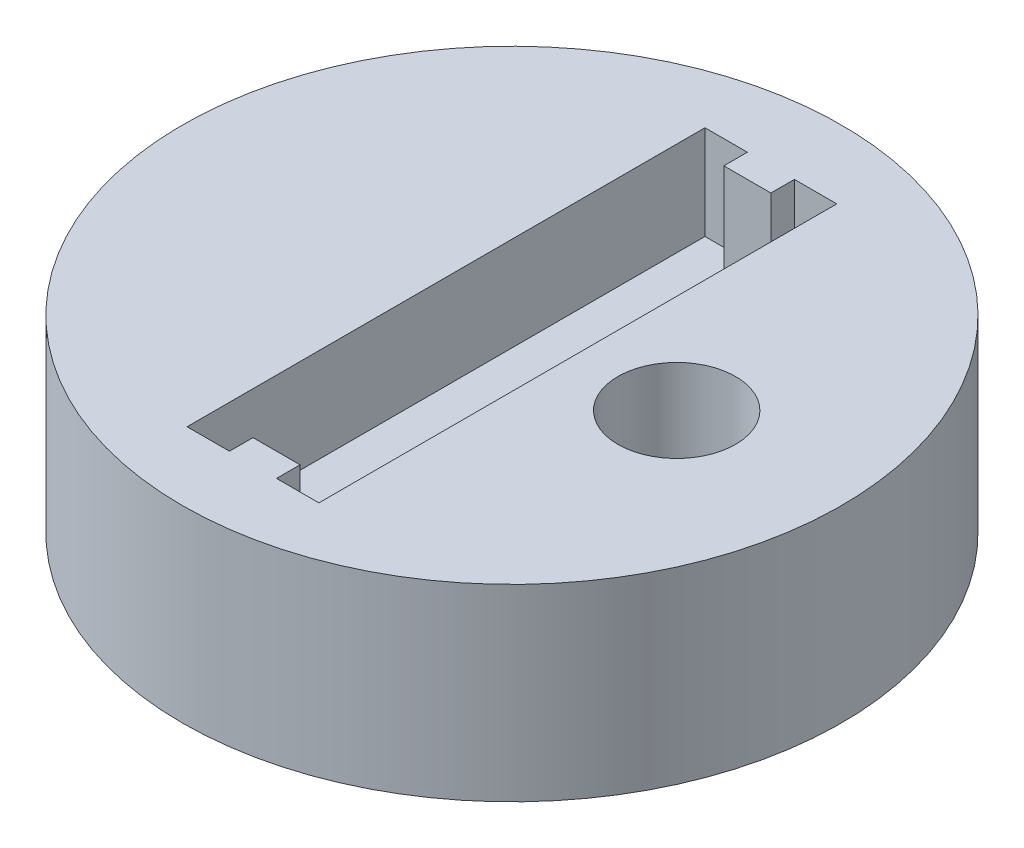
ISO-10303-21;
HEADER;
FILE_DESCRIPTION(('STEP AP214'),'2;1');
FILE_NAME('part.step','',(''),(''),'','','');
FILE_SCHEMA(('AUTOMOTIVE_DESIGN { 1 0 10303 214 1 1 1 1 }'));
ENDSEC;
DATA;
#1=APPLICATION_CONTEXT('core data for automotive mechanical design processes');
#2=APPLICATION_PROTOCOL_DEFINITION('international standard','automotive_design',2000,#1);
#3=PRODUCT_CONTEXT('',#1,'mechanical');
#4=PRODUCT('Part','Part','',(#3));
#5=PRODUCT_RELATED_PRODUCT_CATEGORY('part','',(#4));
#6=PRODUCT_DEFINITION_FORMATION('','',#4);
#7=PRODUCT_DEFINITION_CONTEXT('part definition',#1,'design');
#8=PRODUCT_DEFINITION('design','',#6,#7);
#9=PRODUCT_DEFINITION_SHAPE('','',#8);
#10=(LENGTH_UNIT() NAMED_UNIT(*) SI_UNIT(.MILLI.,.METRE.));
#11=(NAMED_UNIT(*) PLANE_ANGLE_UNIT() SI_UNIT($,.RADIAN.));
#12=(NAMED_UNIT(*) SI_UNIT($,.STERADIAN.) SOLID_ANGLE_UNIT());
#13=UNCERTAINTY_MEASURE_WITH_UNIT(LENGTH_MEASURE(1.E-05),#10,'distance_accuracy_value','');
#14=(GEOMETRIC_REPRESENTATION_CONTEXT(3) GLOBAL_UNCERTAINTY_ASSIGNED_CONTEXT((#13)) GLOBAL_UNIT_ASSIGNED_CONTEXT((#10,
#11,#12)) REPRESENTATION_CONTEXT('',''));
#15=CARTESIAN_POINT('',(0.,0.,0.));
#16=DIRECTION('',(0.,0.,1.));
#17=DIRECTION('',(1.,0.,0.));
#18=AXIS2_PLACEMENT_3D('',#15,#16,#17);
#19=CARTESIAN_POINT('',(0.5,2.,0.));
#20=DIRECTION('',(1.,0.,0.));
#21=DIRECTION('',(0.,0.,-1.));
#22=AXIS2_PLACEMENT_3D('',#19,#20,#21);
#23=PLANE('',#22);
#24=DIRECTION('',(0.,1.,0.));
#25=VECTOR('',#24,1.);
#26=CARTESIAN_POINT('',(0.5,2.,5.));
#27=LINE('',#26,#25);
#28=CARTESIAN_POINT('',(0.5,2.,5.));
#29=VERTEX_POINT('',#28);
#30=CARTESIAN_POINT('',(0.5,4.,5.));
#31=VERTEX_POINT('',#30);
#32=EDGE_CURVE('E180',#29,#31,#27,.T.);
#33=ORIENTED_EDGE('',*,*,#32,.T.);
#34=DIRECTION('',(0.,0.,-1.));
#35=VECTOR('',#34,1.);
#36=CARTESIAN_POINT('',(0.5,4.,0.));
#37=LINE('',#36,#35);
#38=CARTESIAN_POINT('',(0.5,4.,5.5));
#39=VERTEX_POINT('',#38);
#40=EDGE_CURVE('E58',#39,#31,#37,.T.);
#41=ORIENTED_EDGE('',*,*,#40,.F.);
#42=DIRECTION('',(0.,1.,0.));
#43=VECTOR('',#42,1.);
#44=CARTESIAN_POINT('',(0.5,2.,5.5));
#45=LINE('',#44,#43);
#46=CARTESIAN_POINT('',(0.5,2.,5.5));
#47=VERTEX_POINT('',#46);
#48=EDGE_CURVE('E201',#47,#39,#45,.T.);
#49=ORIENTED_EDGE('',*,*,#48,.F.);
#50=DIRECTION('',(0.,0.,-1.));
#51=VECTOR('',#50,1.);
#52=CARTESIAN_POINT('',(0.5,2.,0.));
#53=LINE('',#52,#51);
#54=EDGE_CURVE('E189',#47,#29,#53,.T.);
#55=ORIENTED_EDGE('',*,*,#54,.T.);
#56=EDGE_LOOP('',(#33,#41,#49,#55));
#57=FACE_BOUND('',#56,.T.);
#58=ADVANCED_FACE('F35',(#57),#23,.T.);
#59=CARTESIAN_POINT('',(0.,4.,0.));
#60=DIRECTION('',(0.,1.,0.));
#61=DIRECTION('',(0.,0.,1.));
#62=AXIS2_PLACEMENT_3D('',#59,#60,#61);
#63=PLANE('',#62);
#64=CARTESIAN_POINT('',(3.5,4.,0.));
#65=DIRECTION('',(0.,1.,0.));
#66=DIRECTION('',(0.,0.,1.));
#67=AXIS2_PLACEMENT_3D('',#64,#65,#66);
#68=CIRCLE('',#67,1.25);
#69=CARTESIAN_POINT('',(3.5,4.,1.25));
#70=VERTEX_POINT('',#69);
#71=EDGE_CURVE('E443',#70,#70,#68,.T.);
#72=ORIENTED_EDGE('',*,*,#71,.F.);
#73=EDGE_LOOP('',(#72));
#74=FACE_BOUND('',#73,.T.);
#75=DIRECTION('',(0.,0.,-1.));
#76=VECTOR('',#75,1.);
#77=CARTESIAN_POINT('',(-0.5,4.,0.));
#78=LINE('',#77,#76);
#79=CARTESIAN_POINT('',(-0.5,4.,5.5));
#80=VERTEX_POINT('',#79);
#81=CARTESIAN_POINT('',(-0.5,4.,5.));
#82=VERTEX_POINT('',#81);
#83=EDGE_CURVE('E158',#80,#82,#78,.T.);
#84=ORIENTED_EDGE('',*,*,#83,.F.);
#85=DIRECTION('',(-1.,0.,0.));
#86=VECTOR('',#85,1.);
#87=CARTESIAN_POINT('',(0.,4.,5.5));
#88=LINE('',#87,#86);
#89=CARTESIAN_POINT('',(-1.4,4.,5.5));
#90=VERTEX_POINT('',#89);
#91=EDGE_CURVE('E137',#80,#90,#88,.T.);
#92=ORIENTED_EDGE('',*,*,#91,.T.);
#93=DIRECTION('',(0.,0.,-1.));
#94=VECTOR('',#93,1.);
#95=CARTESIAN_POINT('',(-1.4,4.,0.));
#96=LINE('',#95,#94);
#97=CARTESIAN_POINT('',(-1.4,4.,-5.5));
#98=VERTEX_POINT('',#97);
#99=EDGE_CURVE('E162',#90,#98,#96,.T.);
#100=ORIENTED_EDGE('',*,*,#99,.T.);
#101=DIRECTION('',(-1.,0.,0.));
#102=VECTOR('',#101,1.);
#103=CARTESIAN_POINT('',(0.,4.,-5.5));
#104=LINE('',#103,#102);
#105=CARTESIAN_POINT('',(-0.5,4.,-5.5));
#106=VERTEX_POINT('',#105);
#107=EDGE_CURVE('E160',#106,#98,#104,.T.);
#108=ORIENTED_EDGE('',*,*,#107,.F.);
#109=CARTESIAN_POINT('',(-0.5,4.,-5.));
#110=VERTEX_POINT('',#109);
#111=EDGE_CURVE('E143',#110,#106,#78,.T.);
#112=ORIENTED_EDGE('',*,*,#111,.F.);
#113=DIRECTION('',(-1.,0.,0.));
#114=VECTOR('',#113,1.);
#115=CARTESIAN_POINT('',(-0.5,4.,-5.));
#116=LINE('',#115,#114);
#117=CARTESIAN_POINT('',(0.5,4.,-5.));
#118=VERTEX_POINT('',#117);
#119=EDGE_CURVE('E169',#118,#110,#116,.T.);
#120=ORIENTED_EDGE('',*,*,#119,.F.);
#121=CARTESIAN_POINT('',(0.5,4.,-5.5));
#122=VERTEX_POINT('',#121);
#123=EDGE_CURVE('E182',#118,#122,#37,.T.);
#124=ORIENTED_EDGE('',*,*,#123,.T.);
#125=DIRECTION('',(1.,0.,0.));
#126=VECTOR('',#125,1.);
#127=CARTESIAN_POINT('',(0.,4.,-5.5));
#128=LINE('',#127,#126);
#129=CARTESIAN_POINT('',(1.4,4.,-5.5));
#130=VERTEX_POINT('',#129);
#131=EDGE_CURVE('E209',#122,#130,#128,.T.);
#132=ORIENTED_EDGE('',*,*,#131,.T.);
#133=DIRECTION('',(0.,0.,-1.));
#134=VECTOR('',#133,1.);
#135=CARTESIAN_POINT('',(1.4,4.,0.));
#136=LINE('',#135,#134);
#137=CARTESIAN_POINT('',(1.4,4.,5.5));
#138=VERTEX_POINT('',#137);
#139=EDGE_CURVE('E206',#138,#130,#136,.T.);
#140=ORIENTED_EDGE('',*,*,#139,.F.);
#141=DIRECTION('',(1.,0.,0.));
#142=VECTOR('',#141,1.);
#143=CARTESIAN_POINT('',(0.,4.,5.5));
#144=LINE('',#143,#142);
#145=EDGE_CURVE('E203',#39,#138,#144,.T.);
#146=ORIENTED_EDGE('',*,*,#145,.F.);
#147=ORIENTED_EDGE('',*,*,#40,.T.);
#148=DIRECTION('',(1.,0.,0.));
#149=VECTOR('',#148,1.);
#150=CARTESIAN_POINT('',(-0.5,4.,5.));
#151=LINE('',#150,#149);
#152=EDGE_CURVE('E174',#82,#31,#151,.T.);
#153=ORIENTED_EDGE('',*,*,#152,.F.);
#154=EDGE_LOOP('',(#84,#92,#100,#108,#112,#120,#124,#132,#140,#146,#147,#153));
#155=FACE_BOUND('',#154,.T.);
#156=CARTESIAN_POINT('',(0.,4.,0.));
#157=DIRECTION('',(0.,1.,0.));
#158=DIRECTION('',(0.,0.,1.));
#159=AXIS2_PLACEMENT_3D('',#156,#157,#158);
#160=CIRCLE('',#159,7.);
#161=CARTESIAN_POINT('',(0.,4.,7.));
#162=VERTEX_POINT('',#161);
#163=EDGE_CURVE('E11',#162,#162,#160,.T.);
#164=ORIENTED_EDGE('',*,*,#163,.T.);
#165=EDGE_LOOP('',(#164));
#166=FACE_BOUND('',#165,.T.);
#167=ADVANCED_FACE('F226',(#74,#155,#166),#63,.T.);
#168=CARTESIAN_POINT('',(0.,4.,0.));
#169=DIRECTION('',(0.,-1.,0.));
#170=DIRECTION('',(0.,0.,-1.));
#171=AXIS2_PLACEMENT_3D('',#168,#169,#170);
#172=CYLINDRICAL_SURFACE('',#171,7.);
#173=ORIENTED_EDGE('',*,*,#163,.F.);
#174=EDGE_LOOP('',(#173));
#175=FACE_BOUND('',#174,.T.);
#176=CARTESIAN_POINT('',(0.,0.,0.));
#177=DIRECTION('',(0.,1.,0.));
#178=DIRECTION('',(0.,0.,1.));
#179=AXIS2_PLACEMENT_3D('',#176,#177,#178);
#180=CIRCLE('',#179,7.);
#181=CARTESIAN_POINT('',(0.,0.,7.));
#182=VERTEX_POINT('',#181);
#183=EDGE_CURVE('E39',#182,#182,#180,.T.);
#184=ORIENTED_EDGE('',*,*,#183,.T.);
#185=EDGE_LOOP('',(#184));
#186=FACE_BOUND('',#185,.T.);
#187=ADVANCED_FACE('F37',(#175,#186),#172,.T.);
#188=CARTESIAN_POINT('',(0.,0.,0.));
#189=DIRECTION('',(0.,1.,0.));
#190=DIRECTION('',(0.,0.,1.));
#191=AXIS2_PLACEMENT_3D('',#188,#189,#190);
#192=PLANE('',#191);
#193=ORIENTED_EDGE('',*,*,#183,.F.);
#194=EDGE_LOOP('',(#193));
#195=FACE_BOUND('',#194,.T.);
#196=ADVANCED_FACE('F266',(#195),#192,.F.);
#197=DIRECTION('',(0.,1.,0.));
#198=VECTOR('',#197,1.);
#199=CARTESIAN_POINT('',(0.5,2.,-5.));
#200=LINE('',#199,#198);
#201=CARTESIAN_POINT('',(0.5,2.,-5.));
#202=VERTEX_POINT('',#201);
#203=EDGE_CURVE('E176',#202,#118,#200,.T.);
#204=ORIENTED_EDGE('',*,*,#203,.F.);
#205=CARTESIAN_POINT('',(0.5,2.,-5.5));
#206=VERTEX_POINT('',#205);
#207=EDGE_CURVE('E193',#202,#206,#53,.T.);
#208=ORIENTED_EDGE('',*,*,#207,.T.);
#209=DIRECTION('',(0.,1.,0.));
#210=VECTOR('',#209,1.);
#211=CARTESIAN_POINT('',(0.5,2.,-5.5));
#212=LINE('',#211,#210);
#213=EDGE_CURVE('E212',#206,#122,#212,.T.);
#214=ORIENTED_EDGE('',*,*,#213,.T.);
#215=ORIENTED_EDGE('',*,*,#123,.F.);
#216=EDGE_LOOP('',(#204,#208,#214,#215));
#217=FACE_BOUND('',#216,.T.);
#218=ADVANCED_FACE('F255',(#217),#23,.T.);
#219=CARTESIAN_POINT('',(0.,2.,-5.5));
#220=DIRECTION('',(0.,0.,1.));
#221=DIRECTION('',(1.,0.,0.));
#222=AXIS2_PLACEMENT_3D('',#219,#220,#221);
#223=PLANE('',#222);
#224=ORIENTED_EDGE('',*,*,#131,.F.);
#225=ORIENTED_EDGE('',*,*,#213,.F.);
#226=DIRECTION('',(1.,0.,0.));
#227=VECTOR('',#226,1.);
#228=CARTESIAN_POINT('',(0.,2.,-5.5));
#229=LINE('',#228,#227);
#230=CARTESIAN_POINT('',(1.4,2.,-5.5));
#231=VERTEX_POINT('',#230);
#232=EDGE_CURVE('E199',#206,#231,#229,.T.);
#233=ORIENTED_EDGE('',*,*,#232,.T.);
#234=DIRECTION('',(0.,1.,0.));
#235=VECTOR('',#234,1.);
#236=CARTESIAN_POINT('',(1.4,2.,-5.5));
#237=LINE('',#236,#235);
#238=EDGE_CURVE('E215',#231,#130,#237,.T.);
#239=ORIENTED_EDGE('',*,*,#238,.T.);
#240=EDGE_LOOP('',(#224,#225,#233,#239));
#241=FACE_BOUND('',#240,.T.);
#242=ADVANCED_FACE('F258',(#241),#223,.T.);
#243=CARTESIAN_POINT('',(1.4,2.,0.));
#244=DIRECTION('',(1.,0.,0.));
#245=DIRECTION('',(0.,0.,-1.));
#246=AXIS2_PLACEMENT_3D('',#243,#244,#245);
#247=PLANE('',#246);
#248=ORIENTED_EDGE('',*,*,#139,.T.);
#249=ORIENTED_EDGE('',*,*,#238,.F.);
#250=DIRECTION('',(0.,0.,-1.));
#251=VECTOR('',#250,1.);
#252=CARTESIAN_POINT('',(1.4,2.,0.));
#253=LINE('',#252,#251);
#254=CARTESIAN_POINT('',(1.4,2.,5.5));
#255=VERTEX_POINT('',#254);
#256=EDGE_CURVE('E196',#255,#231,#253,.T.);
#257=ORIENTED_EDGE('',*,*,#256,.F.);
#258=DIRECTION('',(0.,1.,0.));
#259=VECTOR('',#258,1.);
#260=CARTESIAN_POINT('',(1.4,2.,5.5));
#261=LINE('',#260,#259);
#262=EDGE_CURVE('E217',#255,#138,#261,.T.);
#263=ORIENTED_EDGE('',*,*,#262,.T.);
#264=EDGE_LOOP('',(#248,#249,#257,#263));
#265=FACE_BOUND('',#264,.T.);
#266=ADVANCED_FACE('F232',(#265),#247,.F.);
#267=CARTESIAN_POINT('',(0.,2.,5.5));
#268=DIRECTION('',(0.,0.,1.));
#269=DIRECTION('',(1.,0.,0.));
#270=AXIS2_PLACEMENT_3D('',#267,#268,#269);
#271=PLANE('',#270);
#272=ORIENTED_EDGE('',*,*,#145,.T.);
#273=ORIENTED_EDGE('',*,*,#262,.F.);
#274=DIRECTION('',(1.,0.,0.));
#275=VECTOR('',#274,1.);
#276=CARTESIAN_POINT('',(0.,2.,5.5));
#277=LINE('',#276,#275);
#278=EDGE_CURVE('E192',#47,#255,#277,.T.);
#279=ORIENTED_EDGE('',*,*,#278,.F.);
#280=ORIENTED_EDGE('',*,*,#48,.T.);
#281=EDGE_LOOP('',(#272,#273,#279,#280));
#282=FACE_BOUND('',#281,.T.);
#283=ADVANCED_FACE('F222',(#282),#271,.F.);
#284=CARTESIAN_POINT('',(0.,2.,0.));
#285=DIRECTION('',(0.,1.,0.));
#286=DIRECTION('',(0.,0.,1.));
#287=AXIS2_PLACEMENT_3D('',#284,#285,#286);
#288=PLANE('',#287);
#289=ORIENTED_EDGE('',*,*,#54,.F.);
#290=ORIENTED_EDGE('',*,*,#278,.T.);
#291=ORIENTED_EDGE('',*,*,#256,.T.);
#292=ORIENTED_EDGE('',*,*,#232,.F.);
#293=ORIENTED_EDGE('',*,*,#207,.F.);
#294=DIRECTION('',(-1.,0.,0.));
#295=VECTOR('',#294,1.);
#296=CARTESIAN_POINT('',(-0.5,2.,-5.));
#297=LINE('',#296,#295);
#298=CARTESIAN_POINT('',(-0.5,2.,-5.));
#299=VERTEX_POINT('',#298);
#300=EDGE_CURVE('E133',#202,#299,#297,.T.);
#301=ORIENTED_EDGE('',*,*,#300,.T.);
#302=DIRECTION('',(0.,0.,-1.));
#303=VECTOR('',#302,1.);
#304=CARTESIAN_POINT('',(-0.5,2.,0.));
#305=LINE('',#304,#303);
#306=CARTESIAN_POINT('',(-0.5,2.,-5.5));
#307=VERTEX_POINT('',#306);
#308=EDGE_CURVE('E126',#299,#307,#305,.T.);
#309=ORIENTED_EDGE('',*,*,#308,.T.);
#310=DIRECTION('',(-1.,0.,0.));
#311=VECTOR('',#310,1.);
#312=CARTESIAN_POINT('',(0.,2.,-5.5));
#313=LINE('',#312,#311);
#314=CARTESIAN_POINT('',(-1.4,2.,-5.5));
#315=VERTEX_POINT('',#314);
#316=EDGE_CURVE('E131',#307,#315,#313,.T.);
#317=ORIENTED_EDGE('',*,*,#316,.T.);
#318=DIRECTION('',(0.,0.,-1.));
#319=VECTOR('',#318,1.);
#320=CARTESIAN_POINT('',(-1.4,2.,0.));
#321=LINE('',#320,#319);
#322=CARTESIAN_POINT('',(-1.4,2.,5.5));
#323=VERTEX_POINT('',#322);
#324=EDGE_CURVE('E152',#323,#315,#321,.T.);
#325=ORIENTED_EDGE('',*,*,#324,.F.);
#326=DIRECTION('',(-1.,0.,0.));
#327=VECTOR('',#326,1.);
#328=CARTESIAN_POINT('',(0.,2.,5.5));
#329=LINE('',#328,#327);
#330=CARTESIAN_POINT('',(-0.5,2.,5.5));
#331=VERTEX_POINT('',#330);
#332=EDGE_CURVE('E148',#331,#323,#329,.T.);
#333=ORIENTED_EDGE('',*,*,#332,.F.);
#334=CARTESIAN_POINT('',(-0.5,2.,5.));
#335=VERTEX_POINT('',#334);
#336=EDGE_CURVE('E136',#331,#335,#305,.T.);
#337=ORIENTED_EDGE('',*,*,#336,.T.);
#338=DIRECTION('',(1.,0.,0.));
#339=VECTOR('',#338,1.);
#340=CARTESIAN_POINT('',(-0.5,2.,5.));
#341=LINE('',#340,#339);
#342=EDGE_CURVE('E50',#335,#29,#341,.T.);
#343=ORIENTED_EDGE('',*,*,#342,.T.);
#344=EDGE_LOOP('',(#289,#290,#291,#292,#293,#301,#309,#317,#325,#333,#337,#343));
#345=FACE_BOUND('',#344,.T.);
#346=ADVANCED_FACE('F128',(#345),#288,.T.);
#347=CARTESIAN_POINT('',(-0.5,2.,5.));
#348=DIRECTION('',(0.,0.,1.));
#349=DIRECTION('',(1.,0.,0.));
#350=AXIS2_PLACEMENT_3D('',#347,#348,#349);
#351=PLANE('',#350);
#352=ORIENTED_EDGE('',*,*,#152,.T.);
#353=ORIENTED_EDGE('',*,*,#32,.F.);
#354=ORIENTED_EDGE('',*,*,#342,.F.);
#355=DIRECTION('',(0.,1.,0.));
#356=VECTOR('',#355,1.);
#357=CARTESIAN_POINT('',(-0.5,2.,5.));
#358=LINE('',#357,#356);
#359=EDGE_CURVE('E183',#335,#82,#358,.T.);
#360=ORIENTED_EDGE('',*,*,#359,.T.);
#361=EDGE_LOOP('',(#352,#353,#354,#360));
#362=FACE_BOUND('',#361,.T.);
#363=ADVANCED_FACE('F236',(#362),#351,.F.);
#364=CARTESIAN_POINT('',(-0.5,2.,-5.));
#365=DIRECTION('',(0.,0.,-1.));
#366=DIRECTION('',(-1.,0.,0.));
#367=AXIS2_PLACEMENT_3D('',#364,#365,#366);
#368=PLANE('',#367);
#369=ORIENTED_EDGE('',*,*,#119,.T.);
#370=DIRECTION('',(0.,1.,0.));
#371=VECTOR('',#370,1.);
#372=CARTESIAN_POINT('',(-0.5,2.,-5.));
#373=LINE('',#372,#371);
#374=EDGE_CURVE('E186',#299,#110,#373,.T.);
#375=ORIENTED_EDGE('',*,*,#374,.F.);
#376=ORIENTED_EDGE('',*,*,#300,.F.);
#377=ORIENTED_EDGE('',*,*,#203,.T.);
#378=EDGE_LOOP('',(#369,#375,#376,#377));
#379=FACE_BOUND('',#378,.T.);
#380=ADVANCED_FACE('F252',(#379),#368,.F.);
#381=CARTESIAN_POINT('',(-0.5,2.,0.));
#382=DIRECTION('',(1.,0.,0.));
#383=DIRECTION('',(0.,0.,-1.));
#384=AXIS2_PLACEMENT_3D('',#381,#382,#383);
#385=PLANE('',#384);
#386=ORIENTED_EDGE('',*,*,#336,.F.);
#387=DIRECTION('',(0.,1.,0.));
#388=VECTOR('',#387,1.);
#389=CARTESIAN_POINT('',(-0.5,2.,5.5));
#390=LINE('',#389,#388);
#391=EDGE_CURVE('E167',#331,#80,#390,.T.);
#392=ORIENTED_EDGE('',*,*,#391,.T.);
#393=ORIENTED_EDGE('',*,*,#83,.T.);
#394=ORIENTED_EDGE('',*,*,#359,.F.);
#395=EDGE_LOOP('',(#386,#392,#393,#394));
#396=FACE_BOUND('',#395,.T.);
#397=ADVANCED_FACE('F240',(#396),#385,.F.);
#398=ORIENTED_EDGE('',*,*,#111,.T.);
#399=DIRECTION('',(0.,1.,0.));
#400=VECTOR('',#399,1.);
#401=CARTESIAN_POINT('',(-0.5,2.,-5.5));
#402=LINE('',#401,#400);
#403=EDGE_CURVE('E140',#307,#106,#402,.T.);
#404=ORIENTED_EDGE('',*,*,#403,.F.);
#405=ORIENTED_EDGE('',*,*,#308,.F.);
#406=ORIENTED_EDGE('',*,*,#374,.T.);
#407=EDGE_LOOP('',(#398,#404,#405,#406));
#408=FACE_BOUND('',#407,.T.);
#409=ADVANCED_FACE('F141',(#408),#385,.F.);
#410=CARTESIAN_POINT('',(0.,2.,5.5));
#411=DIRECTION('',(0.,0.,-1.));
#412=DIRECTION('',(-1.,0.,0.));
#413=AXIS2_PLACEMENT_3D('',#410,#411,#412);
#414=PLANE('',#413);
#415=ORIENTED_EDGE('',*,*,#91,.F.);
#416=ORIENTED_EDGE('',*,*,#391,.F.);
#417=ORIENTED_EDGE('',*,*,#332,.T.);
#418=DIRECTION('',(0.,1.,0.));
#419=VECTOR('',#418,1.);
#420=CARTESIAN_POINT('',(-1.4,2.,5.5));
#421=LINE('',#420,#419);
#422=EDGE_CURVE('E170',#323,#90,#421,.T.);
#423=ORIENTED_EDGE('',*,*,#422,.T.);
#424=EDGE_LOOP('',(#415,#416,#417,#423));
#425=FACE_BOUND('',#424,.T.);
#426=ADVANCED_FACE('F243',(#425),#414,.T.);
#427=CARTESIAN_POINT('',(-1.4,2.,0.));
#428=DIRECTION('',(1.,0.,0.));
#429=DIRECTION('',(0.,0.,-1.));
#430=AXIS2_PLACEMENT_3D('',#427,#428,#429);
#431=PLANE('',#430);
#432=ORIENTED_EDGE('',*,*,#99,.F.);
#433=ORIENTED_EDGE('',*,*,#422,.F.);
#434=ORIENTED_EDGE('',*,*,#324,.T.);
#435=DIRECTION('',(0.,1.,0.));
#436=VECTOR('',#435,1.);
#437=CARTESIAN_POINT('',(-1.4,2.,-5.5));
#438=LINE('',#437,#436);
#439=EDGE_CURVE('E147',#315,#98,#438,.T.);
#440=ORIENTED_EDGE('',*,*,#439,.T.);
#441=EDGE_LOOP('',(#432,#433,#434,#440));
#442=FACE_BOUND('',#441,.T.);
#443=ADVANCED_FACE('F247',(#442),#431,.T.);
#444=CARTESIAN_POINT('',(0.,2.,-5.5));
#445=DIRECTION('',(0.,0.,-1.));
#446=DIRECTION('',(-1.,0.,0.));
#447=AXIS2_PLACEMENT_3D('',#444,#445,#446);
#448=PLANE('',#447);
#449=ORIENTED_EDGE('',*,*,#107,.T.);
#450=ORIENTED_EDGE('',*,*,#439,.F.);
#451=ORIENTED_EDGE('',*,*,#316,.F.);
#452=ORIENTED_EDGE('',*,*,#403,.T.);
#453=EDGE_LOOP('',(#449,#450,#451,#452));
#454=FACE_BOUND('',#453,.T.);
#455=ADVANCED_FACE('F151',(#454),#448,.F.);
#456=CARTESIAN_POINT('',(3.5,2.,0.));
#457=DIRECTION('',(0.,1.,0.));
#458=DIRECTION('',(0.,0.,1.));
#459=AXIS2_PLACEMENT_3D('',#456,#457,#458);
#460=CYLINDRICAL_SURFACE('',#459,1.25);
#461=CARTESIAN_POINT('',(3.5,2.,0.));
#462=DIRECTION('',(0.,1.,0.));
#463=DIRECTION('',(0.,0.,1.));
#464=AXIS2_PLACEMENT_3D('',#461,#462,#463);
#465=CIRCLE('',#464,1.25);
#466=CARTESIAN_POINT('',(3.5,2.,1.25));
#467=VERTEX_POINT('',#466);
#468=EDGE_CURVE('E250',#467,#467,#465,.T.);
#469=ORIENTED_EDGE('',*,*,#468,.F.);
#470=EDGE_LOOP('',(#469));
#471=FACE_BOUND('',#470,.T.);
#472=ORIENTED_EDGE('',*,*,#71,.T.);
#473=EDGE_LOOP('',(#472));
#474=FACE_BOUND('',#473,.T.);
#475=ADVANCED_FACE('F304',(#471,#474),#460,.F.);
#476=CARTESIAN_POINT('',(0.,2.,0.));
#477=DIRECTION('',(0.,1.,0.));
#478=DIRECTION('',(0.,0.,1.));
#479=AXIS2_PLACEMENT_3D('',#476,#477,#478);
#480=PLANE('',#479);
#481=ORIENTED_EDGE('',*,*,#468,.T.);
#482=EDGE_LOOP('',(#481));
#483=FACE_BOUND('',#482,.T.);
#484=ADVANCED_FACE('F309',(#483),#480,.T.);
#485=CLOSED_SHELL('',(#58,#167,#187,#196,#218,#242,#266,#283,#346,#363,#380,#397,#409,#426,#443,
#455,#475,#484));
#486=MANIFOLD_SOLID_BREP('B2',#485);
#487=ADVANCED_BREP_SHAPE_REPRESENTATION('',(#18,#486),#14);
#488=SHAPE_DEFINITION_REPRESENTATION(#9,#487);
ENDSEC;
END-ISO-10303-21;
